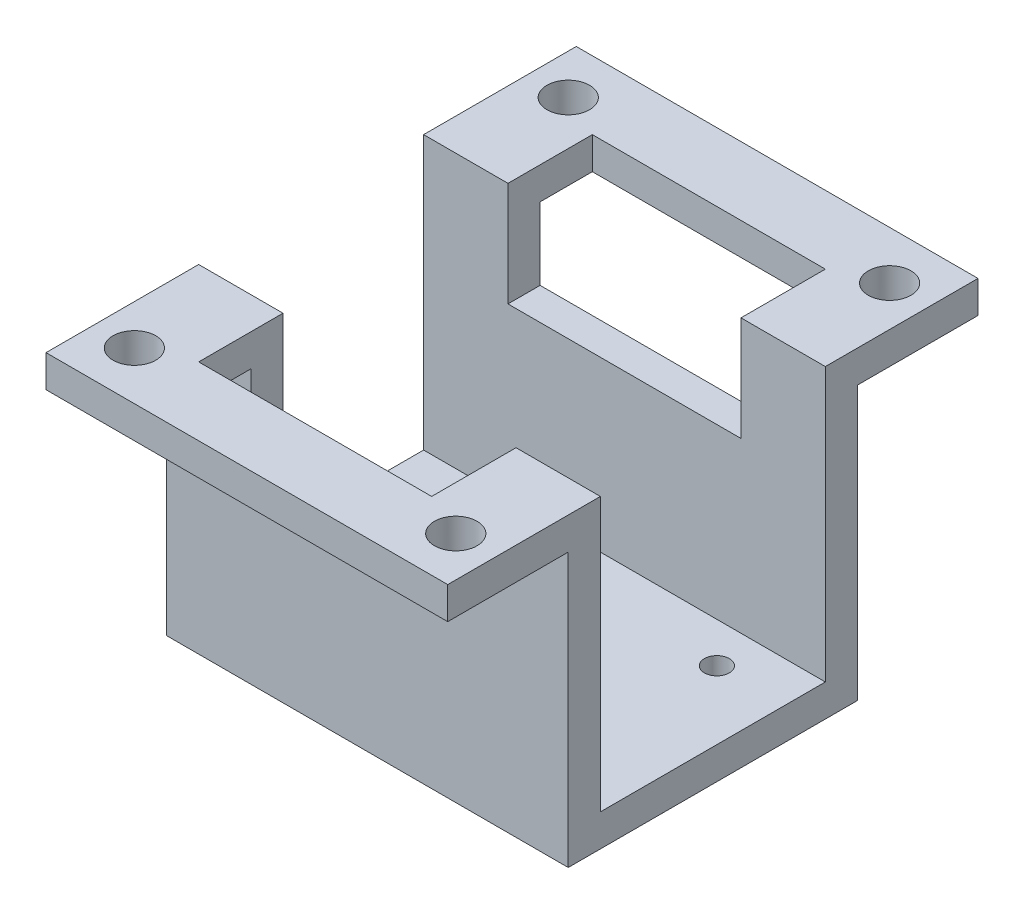
ISO-10303-21;
HEADER;
FILE_DESCRIPTION(('STEP AP214'),'2;1');
FILE_NAME('part.step','',(''),(''),'','','');
FILE_SCHEMA(('AUTOMOTIVE_DESIGN { 1 0 10303 214 1 1 1 1 }'));
ENDSEC;
DATA;
#1=APPLICATION_CONTEXT('core data for automotive mechanical design processes');
#2=APPLICATION_PROTOCOL_DEFINITION('international standard','automotive_design',2000,#1);
#3=PRODUCT_CONTEXT('',#1,'mechanical');
#4=PRODUCT('Part','Part','',(#3));
#5=PRODUCT_RELATED_PRODUCT_CATEGORY('part','',(#4));
#6=PRODUCT_DEFINITION_FORMATION('','',#4);
#7=PRODUCT_DEFINITION_CONTEXT('part definition',#1,'design');
#8=PRODUCT_DEFINITION('design','',#6,#7);
#9=PRODUCT_DEFINITION_SHAPE('','',#8);
#10=(LENGTH_UNIT() NAMED_UNIT(*) SI_UNIT(.MILLI.,.METRE.));
#11=(NAMED_UNIT(*) PLANE_ANGLE_UNIT() SI_UNIT($,.RADIAN.));
#12=(NAMED_UNIT(*) SI_UNIT($,.STERADIAN.) SOLID_ANGLE_UNIT());
#13=UNCERTAINTY_MEASURE_WITH_UNIT(LENGTH_MEASURE(1.E-05),#10,'distance_accuracy_value','');
#14=(GEOMETRIC_REPRESENTATION_CONTEXT(3) GLOBAL_UNCERTAINTY_ASSIGNED_CONTEXT((#13)) GLOBAL_UNIT_ASSIGNED_CONTEXT((#10,
#11,#12)) REPRESENTATION_CONTEXT('',''));
#15=CARTESIAN_POINT('',(0.,0.,0.));
#16=DIRECTION('',(0.,0.,1.));
#17=DIRECTION('',(1.,0.,0.));
#18=AXIS2_PLACEMENT_3D('',#15,#16,#17);
#19=CARTESIAN_POINT('',(0.,38.,0.));
#20=DIRECTION('',(0.,1.,0.));
#21=DIRECTION('',(0.,0.,1.));
#22=AXIS2_PLACEMENT_3D('',#19,#20,#21);
#23=PLANE('',#22);
#24=CARTESIAN_POINT('',(36.5,38.,-36.));
#25=DIRECTION('',(0.,1.,0.));
#26=DIRECTION('',(0.,0.,1.));
#27=AXIS2_PLACEMENT_3D('',#24,#25,#26);
#28=CIRCLE('',#27,2.65);
#29=CARTESIAN_POINT('',(36.5,38.,-33.35));
#30=VERTEX_POINT('',#29);
#31=EDGE_CURVE('E601',#30,#30,#28,.T.);
#32=ORIENTED_EDGE('',*,*,#31,.F.);
#33=EDGE_LOOP('',(#32));
#34=FACE_BOUND('',#33,.T.);
#35=DIRECTION('',(0.,0.,1.));
#36=VECTOR('',#35,1.);
#37=CARTESIAN_POINT('',(2.00000000000001,38.,-27.));
#38=LINE('',#37,#36);
#39=CARTESIAN_POINT('',(2.00000000000001,38.,-33.5));
#40=VERTEX_POINT('',#39);
#41=CARTESIAN_POINT('',(2.00000000000001,38.,-23.));
#42=VERTEX_POINT('',#41);
#43=EDGE_CURVE('E206',#40,#42,#38,.T.);
#44=ORIENTED_EDGE('',*,*,#43,.F.);
#45=DIRECTION('',(-1.,0.,0.));
#46=VECTOR('',#45,1.);
#47=CARTESIAN_POINT('',(2.00000000000001,38.,-33.5));
#48=LINE('',#47,#46);
#49=CARTESIAN_POINT('',(31.,38.,-33.5));
#50=VERTEX_POINT('',#49);
#51=EDGE_CURVE('E225',#50,#40,#48,.T.);
#52=ORIENTED_EDGE('',*,*,#51,.F.);
#53=DIRECTION('',(0.,0.,1.));
#54=VECTOR('',#53,1.);
#55=CARTESIAN_POINT('',(31.,38.,-27.));
#56=LINE('',#55,#54);
#57=CARTESIAN_POINT('',(31.,38.,-23.));
#58=VERTEX_POINT('',#57);
#59=EDGE_CURVE('E207',#50,#58,#56,.T.);
#60=ORIENTED_EDGE('',*,*,#59,.T.);
#61=DIRECTION('',(1.,0.,0.));
#62=VECTOR('',#61,1.);
#63=CARTESIAN_POINT('',(0.,38.,-23.));
#64=LINE('',#63,#62);
#65=CARTESIAN_POINT('',(41.5,38.,-23.));
#66=VERTEX_POINT('',#65);
#67=EDGE_CURVE('E461',#58,#66,#64,.T.);
#68=ORIENTED_EDGE('',*,*,#67,.T.);
#69=DIRECTION('',(0.,0.,-1.));
#70=VECTOR('',#69,1.);
#71=CARTESIAN_POINT('',(41.5,38.,0.));
#72=LINE('',#71,#70);
#73=CARTESIAN_POINT('',(41.5,38.,-42.));
#74=VERTEX_POINT('',#73);
#75=EDGE_CURVE('E476',#66,#74,#72,.T.);
#76=ORIENTED_EDGE('',*,*,#75,.T.);
#77=DIRECTION('',(1.,0.,0.));
#78=VECTOR('',#77,1.);
#79=CARTESIAN_POINT('',(-8.5,38.,-42.));
#80=LINE('',#79,#78);
#81=CARTESIAN_POINT('',(-8.5,38.,-42.));
#82=VERTEX_POINT('',#81);
#83=EDGE_CURVE('E243',#82,#74,#80,.T.);
#84=ORIENTED_EDGE('',*,*,#83,.F.);
#85=DIRECTION('',(0.,0.,1.));
#86=VECTOR('',#85,1.);
#87=CARTESIAN_POINT('',(-8.49999999999999,38.,0.));
#88=LINE('',#87,#86);
#89=CARTESIAN_POINT('',(-8.5,38.,-23.));
#90=VERTEX_POINT('',#89);
#91=EDGE_CURVE('E471',#82,#90,#88,.T.);
#92=ORIENTED_EDGE('',*,*,#91,.T.);
#93=EDGE_CURVE('E474',#90,#42,#64,.T.);
#94=ORIENTED_EDGE('',*,*,#93,.T.);
#95=EDGE_LOOP('',(#44,#52,#60,#68,#76,#84,#92,#94));
#96=FACE_BOUND('',#95,.T.);
#97=CARTESIAN_POINT('',(-3.5,38.,-36.));
#98=DIRECTION('',(0.,1.,0.));
#99=DIRECTION('',(0.,0.,1.));
#100=AXIS2_PLACEMENT_3D('',#97,#98,#99);
#101=CIRCLE('',#100,2.65);
#102=CARTESIAN_POINT('',(-3.5,38.,-33.35));
#103=VERTEX_POINT('',#102);
#104=EDGE_CURVE('E607',#103,#103,#101,.F.);
#105=ORIENTED_EDGE('',*,*,#104,.T.);
#106=EDGE_LOOP('',(#105));
#107=FACE_BOUND('',#106,.T.);
#108=ADVANCED_FACE('F32',(#34,#96,#107),#23,.T.);
#109=CARTESIAN_POINT('',(-8.5,34.,-42.));
#110=DIRECTION('',(0.,1.,0.));
#111=DIRECTION('',(0.,0.,1.));
#112=AXIS2_PLACEMENT_3D('',#109,#110,#111);
#113=PLANE('',#112);
#114=CARTESIAN_POINT('',(36.5,34.,-36.));
#115=DIRECTION('',(0.,-1.,0.));
#116=DIRECTION('',(0.,0.,-1.));
#117=AXIS2_PLACEMENT_3D('',#114,#115,#116);
#118=CIRCLE('',#117,2.65);
#119=CARTESIAN_POINT('',(36.5,34.,-38.65));
#120=VERTEX_POINT('',#119);
#121=EDGE_CURVE('E596',#120,#120,#118,.T.);
#122=ORIENTED_EDGE('',*,*,#121,.F.);
#123=EDGE_LOOP('',(#122));
#124=FACE_BOUND('',#123,.T.);
#125=DIRECTION('',(-1.,0.,0.));
#126=VECTOR('',#125,1.);
#127=CARTESIAN_POINT('',(-8.5,34.,-33.5));
#128=LINE('',#127,#126);
#129=CARTESIAN_POINT('',(31.,34.,-33.5));
#130=VERTEX_POINT('',#129);
#131=CARTESIAN_POINT('',(2.00000000000001,34.,-33.5));
#132=VERTEX_POINT('',#131);
#133=EDGE_CURVE('E274',#130,#132,#128,.T.);
#134=ORIENTED_EDGE('',*,*,#133,.T.);
#135=DIRECTION('',(0.,0.,1.));
#136=VECTOR('',#135,1.);
#137=CARTESIAN_POINT('',(2.00000000000001,34.,-42.));
#138=LINE('',#137,#136);
#139=CARTESIAN_POINT('',(2.00000000000001,34.,-27.));
#140=VERTEX_POINT('',#139);
#141=EDGE_CURVE('E238',#132,#140,#138,.T.);
#142=ORIENTED_EDGE('',*,*,#141,.T.);
#143=DIRECTION('',(-1.,0.,0.));
#144=VECTOR('',#143,1.);
#145=CARTESIAN_POINT('',(-8.5,34.,-27.));
#146=LINE('',#145,#144);
#147=CARTESIAN_POINT('',(-8.5,34.,-27.));
#148=VERTEX_POINT('',#147);
#149=EDGE_CURVE('E257',#140,#148,#146,.T.);
#150=ORIENTED_EDGE('',*,*,#149,.T.);
#151=DIRECTION('',(0.,0.,1.));
#152=VECTOR('',#151,1.);
#153=CARTESIAN_POINT('',(-8.5,34.,-42.));
#154=LINE('',#153,#152);
#155=CARTESIAN_POINT('',(-8.5,34.,-42.));
#156=VERTEX_POINT('',#155);
#157=EDGE_CURVE('E250',#156,#148,#154,.T.);
#158=ORIENTED_EDGE('',*,*,#157,.F.);
#159=DIRECTION('',(-1.,0.,0.));
#160=VECTOR('',#159,1.);
#161=CARTESIAN_POINT('',(-8.5,34.,-42.));
#162=LINE('',#161,#160);
#163=CARTESIAN_POINT('',(41.5,34.,-42.));
#164=VERTEX_POINT('',#163);
#165=EDGE_CURVE('E248',#164,#156,#162,.T.);
#166=ORIENTED_EDGE('',*,*,#165,.F.);
#167=DIRECTION('',(0.,0.,1.));
#168=VECTOR('',#167,1.);
#169=CARTESIAN_POINT('',(41.5,34.,-42.));
#170=LINE('',#169,#168);
#171=CARTESIAN_POINT('',(41.5,34.,-27.));
#172=VERTEX_POINT('',#171);
#173=EDGE_CURVE('E265',#164,#172,#170,.T.);
#174=ORIENTED_EDGE('',*,*,#173,.T.);
#175=CARTESIAN_POINT('',(31.,34.,-27.));
#176=VERTEX_POINT('',#175);
#177=EDGE_CURVE('E55',#172,#176,#146,.T.);
#178=ORIENTED_EDGE('',*,*,#177,.T.);
#179=DIRECTION('',(0.,0.,-1.));
#180=VECTOR('',#179,1.);
#181=CARTESIAN_POINT('',(31.,34.,-42.));
#182=LINE('',#181,#180);
#183=EDGE_CURVE('E233',#176,#130,#182,.T.);
#184=ORIENTED_EDGE('',*,*,#183,.T.);
#185=EDGE_LOOP('',(#134,#142,#150,#158,#166,#174,#178,#184));
#186=FACE_BOUND('',#185,.T.);
#187=CARTESIAN_POINT('',(-3.5,34.,-36.));
#188=DIRECTION('',(0.,-1.,0.));
#189=DIRECTION('',(0.,0.,-1.));
#190=AXIS2_PLACEMENT_3D('',#187,#188,#189);
#191=CIRCLE('',#190,2.65);
#192=CARTESIAN_POINT('',(-3.5,34.,-38.65));
#193=VERTEX_POINT('',#192);
#194=EDGE_CURVE('E604',#193,#193,#191,.F.);
#195=ORIENTED_EDGE('',*,*,#194,.T.);
#196=EDGE_LOOP('',(#195));
#197=FACE_BOUND('',#196,.T.);
#198=ADVANCED_FACE('F413',(#124,#186,#197),#113,.F.);
#199=CARTESIAN_POINT('',(0.,38.,0.));
#200=DIRECTION('',(0.,1.,0.));
#201=DIRECTION('',(0.,0.,1.));
#202=AXIS2_PLACEMENT_3D('',#199,#200,#201);
#203=PLANE('',#202);
#204=CARTESIAN_POINT('',(-3.5,38.,18.));
#205=DIRECTION('',(0.,1.,0.));
#206=DIRECTION('',(0.,0.,1.));
#207=AXIS2_PLACEMENT_3D('',#204,#205,#206);
#208=CIRCLE('',#207,2.65);
#209=CARTESIAN_POINT('',(-3.5,38.,20.65));
#210=VERTEX_POINT('',#209);
#211=EDGE_CURVE('E592',#210,#210,#208,.T.);
#212=ORIENTED_EDGE('',*,*,#211,.F.);
#213=EDGE_LOOP('',(#212));
#214=FACE_BOUND('',#213,.T.);
#215=DIRECTION('',(1.,0.,0.));
#216=VECTOR('',#215,1.);
#217=CARTESIAN_POINT('',(2.00000000000001,38.,15.5));
#218=LINE('',#217,#216);
#219=CARTESIAN_POINT('',(2.00000000000001,38.,15.5));
#220=VERTEX_POINT('',#219);
#221=CARTESIAN_POINT('',(31.,38.,15.5));
#222=VERTEX_POINT('',#221);
#223=EDGE_CURVE('E210',#220,#222,#218,.T.);
#224=ORIENTED_EDGE('',*,*,#223,.F.);
#225=CARTESIAN_POINT('',(2.00000000000001,38.,5.));
#226=VERTEX_POINT('',#225);
#227=EDGE_CURVE('E195',#226,#220,#38,.T.);
#228=ORIENTED_EDGE('',*,*,#227,.F.);
#229=DIRECTION('',(1.,0.,0.));
#230=VECTOR('',#229,1.);
#231=CARTESIAN_POINT('',(0.,38.,5.));
#232=LINE('',#231,#230);
#233=CARTESIAN_POINT('',(-8.49999999999999,38.,5.));
#234=VERTEX_POINT('',#233);
#235=EDGE_CURVE('E332',#234,#226,#232,.T.);
#236=ORIENTED_EDGE('',*,*,#235,.F.);
#237=DIRECTION('',(0.,0.,1.));
#238=VECTOR('',#237,1.);
#239=CARTESIAN_POINT('',(-8.49999999999999,38.,0.));
#240=LINE('',#239,#238);
#241=CARTESIAN_POINT('',(-8.49999999999999,38.,24.));
#242=VERTEX_POINT('',#241);
#243=EDGE_CURVE('E331',#234,#242,#240,.T.);
#244=ORIENTED_EDGE('',*,*,#243,.T.);
#245=DIRECTION('',(-1.,0.,0.));
#246=VECTOR('',#245,1.);
#247=CARTESIAN_POINT('',(-8.49999999999999,38.,24.));
#248=LINE('',#247,#246);
#249=CARTESIAN_POINT('',(41.5,38.,24.));
#250=VERTEX_POINT('',#249);
#251=EDGE_CURVE('E253',#250,#242,#248,.T.);
#252=ORIENTED_EDGE('',*,*,#251,.F.);
#253=DIRECTION('',(0.,0.,-1.));
#254=VECTOR('',#253,1.);
#255=CARTESIAN_POINT('',(41.5,38.,0.));
#256=LINE('',#255,#254);
#257=CARTESIAN_POINT('',(41.5,38.,5.));
#258=VERTEX_POINT('',#257);
#259=EDGE_CURVE('E328',#250,#258,#256,.T.);
#260=ORIENTED_EDGE('',*,*,#259,.T.);
#261=CARTESIAN_POINT('',(31.,38.,5.));
#262=VERTEX_POINT('',#261);
#263=EDGE_CURVE('E360',#262,#258,#232,.T.);
#264=ORIENTED_EDGE('',*,*,#263,.F.);
#265=EDGE_CURVE('E217',#262,#222,#56,.T.);
#266=ORIENTED_EDGE('',*,*,#265,.T.);
#267=EDGE_LOOP('',(#224,#228,#236,#244,#252,#260,#264,#266));
#268=FACE_BOUND('',#267,.T.);
#269=CARTESIAN_POINT('',(36.5,38.,18.));
#270=DIRECTION('',(0.,1.,0.));
#271=DIRECTION('',(0.,0.,1.));
#272=AXIS2_PLACEMENT_3D('',#269,#270,#271);
#273=CIRCLE('',#272,2.65);
#274=CARTESIAN_POINT('',(36.5,38.,20.65));
#275=VERTEX_POINT('',#274);
#276=EDGE_CURVE('E218',#275,#275,#273,.F.);
#277=ORIENTED_EDGE('',*,*,#276,.T.);
#278=EDGE_LOOP('',(#277));
#279=FACE_BOUND('',#278,.T.);
#280=ADVANCED_FACE('F214',(#214,#268,#279),#203,.T.);
#281=CARTESIAN_POINT('',(2.00000000000001,34.,24.));
#282=DIRECTION('',(0.,1.,0.));
#283=DIRECTION('',(0.,0.,1.));
#284=AXIS2_PLACEMENT_3D('',#281,#282,#283);
#285=PLANE('',#284);
#286=CARTESIAN_POINT('',(-3.5,34.,18.));
#287=DIRECTION('',(0.,-1.,0.));
#288=DIRECTION('',(0.,0.,-1.));
#289=AXIS2_PLACEMENT_3D('',#286,#287,#288);
#290=CIRCLE('',#289,2.65);
#291=CARTESIAN_POINT('',(-3.5,34.,15.35));
#292=VERTEX_POINT('',#291);
#293=EDGE_CURVE('E594',#292,#292,#290,.T.);
#294=ORIENTED_EDGE('',*,*,#293,.F.);
#295=EDGE_LOOP('',(#294));
#296=FACE_BOUND('',#295,.T.);
#297=DIRECTION('',(1.,0.,0.));
#298=VECTOR('',#297,1.);
#299=CARTESIAN_POINT('',(2.00000000000001,34.,9.));
#300=LINE('',#299,#298);
#301=CARTESIAN_POINT('',(-8.49999999999999,34.,9.));
#302=VERTEX_POINT('',#301);
#303=CARTESIAN_POINT('',(2.00000000000001,34.,9.));
#304=VERTEX_POINT('',#303);
#305=EDGE_CURVE('E268',#302,#304,#300,.T.);
#306=ORIENTED_EDGE('',*,*,#305,.T.);
#307=DIRECTION('',(0.,0.,1.));
#308=VECTOR('',#307,1.);
#309=CARTESIAN_POINT('',(2.00000000000001,34.,24.));
#310=LINE('',#309,#308);
#311=CARTESIAN_POINT('',(2.00000000000001,34.,15.5));
#312=VERTEX_POINT('',#311);
#313=EDGE_CURVE('E11',#304,#312,#310,.T.);
#314=ORIENTED_EDGE('',*,*,#313,.T.);
#315=DIRECTION('',(1.,0.,0.));
#316=VECTOR('',#315,1.);
#317=CARTESIAN_POINT('',(2.00000000000001,34.,15.5));
#318=LINE('',#317,#316);
#319=CARTESIAN_POINT('',(31.,34.,15.5));
#320=VERTEX_POINT('',#319);
#321=EDGE_CURVE('E212',#312,#320,#318,.T.);
#322=ORIENTED_EDGE('',*,*,#321,.T.);
#323=DIRECTION('',(0.,0.,-1.));
#324=VECTOR('',#323,1.);
#325=CARTESIAN_POINT('',(31.,34.,24.));
#326=LINE('',#325,#324);
#327=CARTESIAN_POINT('',(31.,34.,9.));
#328=VERTEX_POINT('',#327);
#329=EDGE_CURVE('E40',#320,#328,#326,.T.);
#330=ORIENTED_EDGE('',*,*,#329,.T.);
#331=CARTESIAN_POINT('',(41.5,34.,9.));
#332=VERTEX_POINT('',#331);
#333=EDGE_CURVE('E302',#328,#332,#300,.T.);
#334=ORIENTED_EDGE('',*,*,#333,.T.);
#335=DIRECTION('',(0.,0.,-1.));
#336=VECTOR('',#335,1.);
#337=CARTESIAN_POINT('',(41.5,34.,24.));
#338=LINE('',#337,#336);
#339=CARTESIAN_POINT('',(41.5,34.,24.));
#340=VERTEX_POINT('',#339);
#341=EDGE_CURVE('E309',#340,#332,#338,.T.);
#342=ORIENTED_EDGE('',*,*,#341,.F.);
#343=DIRECTION('',(1.,0.,0.));
#344=VECTOR('',#343,1.);
#345=CARTESIAN_POINT('',(-8.49999999999999,34.,24.));
#346=LINE('',#345,#344);
#347=CARTESIAN_POINT('',(-8.49999999999999,34.,24.));
#348=VERTEX_POINT('',#347);
#349=EDGE_CURVE('E318',#348,#340,#346,.T.);
#350=ORIENTED_EDGE('',*,*,#349,.F.);
#351=DIRECTION('',(0.,0.,-1.));
#352=VECTOR('',#351,1.);
#353=CARTESIAN_POINT('',(-8.49999999999999,34.,24.));
#354=LINE('',#353,#352);
#355=EDGE_CURVE('E291',#348,#302,#354,.T.);
#356=ORIENTED_EDGE('',*,*,#355,.T.);
#357=EDGE_LOOP('',(#306,#314,#322,#330,#334,#342,#350,#356));
#358=FACE_BOUND('',#357,.T.);
#359=CARTESIAN_POINT('',(36.5,34.,18.));
#360=DIRECTION('',(0.,-1.,0.));
#361=DIRECTION('',(0.,0.,-1.));
#362=AXIS2_PLACEMENT_3D('',#359,#360,#361);
#363=CIRCLE('',#362,2.65);
#364=CARTESIAN_POINT('',(36.5,34.,15.35));
#365=VERTEX_POINT('',#364);
#366=EDGE_CURVE('E221',#365,#365,#363,.F.);
#367=ORIENTED_EDGE('',*,*,#366,.T.);
#368=EDGE_LOOP('',(#367));
#369=FACE_BOUND('',#368,.T.);
#370=ADVANCED_FACE('F341',(#296,#358,#369),#285,.F.);
#371=CARTESIAN_POINT('',(-8.5,4.,-27.));
#372=DIRECTION('',(0.,0.,1.));
#373=DIRECTION('',(1.,0.,0.));
#374=AXIS2_PLACEMENT_3D('',#371,#372,#373);
#375=PLANE('',#374);
#376=DIRECTION('',(-1.,0.,0.));
#377=VECTOR('',#376,1.);
#378=CARTESIAN_POINT('',(-8.5,0.,-27.));
#379=LINE('',#378,#377);
#380=CARTESIAN_POINT('',(41.5,0.,-27.));
#381=VERTEX_POINT('',#380);
#382=CARTESIAN_POINT('',(-8.5,0.,-27.));
#383=VERTEX_POINT('',#382);
#384=EDGE_CURVE('E381',#381,#383,#379,.T.);
#385=ORIENTED_EDGE('',*,*,#384,.T.);
#386=DIRECTION('',(0.,-1.,0.));
#387=VECTOR('',#386,1.);
#388=CARTESIAN_POINT('',(-8.5,4.,-27.));
#389=LINE('',#388,#387);
#390=EDGE_CURVE('E392',#148,#383,#389,.T.);
#391=ORIENTED_EDGE('',*,*,#390,.F.);
#392=ORIENTED_EDGE('',*,*,#149,.F.);
#393=DIRECTION('',(0.,-1.,0.));
#394=VECTOR('',#393,1.);
#395=CARTESIAN_POINT('',(2.00000000000001,38.,-27.));
#396=LINE('',#395,#394);
#397=CARTESIAN_POINT('',(2.00000000000001,25.,-27.));
#398=VERTEX_POINT('',#397);
#399=EDGE_CURVE('E298',#140,#398,#396,.T.);
#400=ORIENTED_EDGE('',*,*,#399,.T.);
#401=DIRECTION('',(1.,0.,0.));
#402=VECTOR('',#401,1.);
#403=CARTESIAN_POINT('',(2.00000000000001,25.,-27.));
#404=LINE('',#403,#402);
#405=CARTESIAN_POINT('',(31.,25.,-27.));
#406=VERTEX_POINT('',#405);
#407=EDGE_CURVE('E427',#398,#406,#404,.T.);
#408=ORIENTED_EDGE('',*,*,#407,.T.);
#409=DIRECTION('',(0.,1.,0.));
#410=VECTOR('',#409,1.);
#411=CARTESIAN_POINT('',(31.,38.,-27.));
#412=LINE('',#411,#410);
#413=EDGE_CURVE('E431',#406,#176,#412,.T.);
#414=ORIENTED_EDGE('',*,*,#413,.T.);
#415=ORIENTED_EDGE('',*,*,#177,.F.);
#416=DIRECTION('',(0.,-1.,0.));
#417=VECTOR('',#416,1.);
#418=CARTESIAN_POINT('',(41.5,4.,-27.));
#419=LINE('',#418,#417);
#420=EDGE_CURVE('E395',#172,#381,#419,.T.);
#421=ORIENTED_EDGE('',*,*,#420,.T.);
#422=EDGE_LOOP('',(#385,#391,#392,#400,#408,#414,#415,#421));
#423=FACE_BOUND('',#422,.T.);
#424=ADVANCED_FACE('F403',(#423),#375,.F.);
#425=CARTESIAN_POINT('',(-8.49999999999999,4.,9.));
#426=DIRECTION('',(0.,0.,-1.));
#427=DIRECTION('',(-1.,0.,0.));
#428=AXIS2_PLACEMENT_3D('',#425,#426,#427);
#429=PLANE('',#428);
#430=DIRECTION('',(0.,1.,0.));
#431=VECTOR('',#430,1.);
#432=CARTESIAN_POINT('',(31.,38.,9.));
#433=LINE('',#432,#431);
#434=CARTESIAN_POINT('',(31.,25.,9.));
#435=VERTEX_POINT('',#434);
#436=EDGE_CURVE('E421',#435,#328,#433,.T.);
#437=ORIENTED_EDGE('',*,*,#436,.F.);
#438=DIRECTION('',(1.,0.,0.));
#439=VECTOR('',#438,1.);
#440=CARTESIAN_POINT('',(2.00000000000001,25.,9.));
#441=LINE('',#440,#439);
#442=CARTESIAN_POINT('',(2.00000000000001,25.,9.));
#443=VERTEX_POINT('',#442);
#444=EDGE_CURVE('E426',#443,#435,#441,.T.);
#445=ORIENTED_EDGE('',*,*,#444,.F.);
#446=DIRECTION('',(0.,-1.,0.));
#447=VECTOR('',#446,1.);
#448=CARTESIAN_POINT('',(2.00000000000001,38.,9.));
#449=LINE('',#448,#447);
#450=EDGE_CURVE('E316',#304,#443,#449,.T.);
#451=ORIENTED_EDGE('',*,*,#450,.F.);
#452=ORIENTED_EDGE('',*,*,#305,.F.);
#453=DIRECTION('',(0.,-1.,0.));
#454=VECTOR('',#453,1.);
#455=CARTESIAN_POINT('',(-8.49999999999999,4.,9.));
#456=LINE('',#455,#454);
#457=CARTESIAN_POINT('',(-8.49999999999999,0.,9.));
#458=VERTEX_POINT('',#457);
#459=EDGE_CURVE('E339',#302,#458,#456,.T.);
#460=ORIENTED_EDGE('',*,*,#459,.T.);
#461=DIRECTION('',(1.,0.,0.));
#462=VECTOR('',#461,1.);
#463=CARTESIAN_POINT('',(-8.49999999999999,0.,9.));
#464=LINE('',#463,#462);
#465=CARTESIAN_POINT('',(41.5,0.,9.));
#466=VERTEX_POINT('',#465);
#467=EDGE_CURVE('E386',#458,#466,#464,.T.);
#468=ORIENTED_EDGE('',*,*,#467,.T.);
#469=DIRECTION('',(0.,-1.,0.));
#470=VECTOR('',#469,1.);
#471=CARTESIAN_POINT('',(41.5,4.,9.));
#472=LINE('',#471,#470);
#473=EDGE_CURVE('E306',#332,#466,#472,.T.);
#474=ORIENTED_EDGE('',*,*,#473,.F.);
#475=ORIENTED_EDGE('',*,*,#333,.F.);
#476=EDGE_LOOP('',(#437,#445,#451,#452,#460,#468,#474,#475));
#477=FACE_BOUND('',#476,.T.);
#478=ADVANCED_FACE('F419',(#477),#429,.F.);
#479=CARTESIAN_POINT('',(0.,4.,0.));
#480=DIRECTION('',(0.,1.,0.));
#481=DIRECTION('',(0.,0.,1.));
#482=AXIS2_PLACEMENT_3D('',#479,#480,#481);
#483=PLANE('',#482);
#484=CARTESIAN_POINT('',(33.,4.,-18.));
#485=DIRECTION('',(0.,1.,0.));
#486=DIRECTION('',(0.,0.,1.));
#487=AXIS2_PLACEMENT_3D('',#484,#485,#486);
#488=CIRCLE('',#487,1.55);
#489=CARTESIAN_POINT('',(33.,4.,-16.45));
#490=VERTEX_POINT('',#489);
#491=EDGE_CURVE('E913',#490,#490,#488,.T.);
#492=ORIENTED_EDGE('',*,*,#491,.F.);
#493=EDGE_LOOP('',(#492));
#494=FACE_BOUND('',#493,.T.);
#495=CARTESIAN_POINT('',(0.,4.,0.));
#496=DIRECTION('',(0.,1.,0.));
#497=DIRECTION('',(0.,0.,1.));
#498=AXIS2_PLACEMENT_3D('',#495,#496,#497);
#499=CIRCLE('',#498,1.55);
#500=CARTESIAN_POINT('',(0.,4.,1.55));
#501=VERTEX_POINT('',#500);
#502=EDGE_CURVE('E889',#501,#501,#499,.T.);
#503=ORIENTED_EDGE('',*,*,#502,.F.);
#504=EDGE_LOOP('',(#503));
#505=FACE_BOUND('',#504,.T.);
#506=CARTESIAN_POINT('',(0.,4.,-18.));
#507=DIRECTION('',(0.,1.,0.));
#508=DIRECTION('',(0.,0.,1.));
#509=AXIS2_PLACEMENT_3D('',#506,#507,#508);
#510=CIRCLE('',#509,1.55);
#511=CARTESIAN_POINT('',(0.,4.,-16.45));
#512=VERTEX_POINT('',#511);
#513=EDGE_CURVE('E382',#512,#512,#510,.T.);
#514=ORIENTED_EDGE('',*,*,#513,.F.);
#515=EDGE_LOOP('',(#514));
#516=FACE_BOUND('',#515,.T.);
#517=CARTESIAN_POINT('',(33.,4.,0.));
#518=DIRECTION('',(0.,1.,0.));
#519=DIRECTION('',(0.,0.,1.));
#520=AXIS2_PLACEMENT_3D('',#517,#518,#519);
#521=CIRCLE('',#520,1.55);
#522=CARTESIAN_POINT('',(33.,4.,1.55));
#523=VERTEX_POINT('',#522);
#524=EDGE_CURVE('E890',#523,#523,#521,.T.);
#525=ORIENTED_EDGE('',*,*,#524,.F.);
#526=EDGE_LOOP('',(#525));
#527=FACE_BOUND('',#526,.T.);
#528=CARTESIAN_POINT('',(9.,4.,-9.));
#529=DIRECTION('',(0.,1.,0.));
#530=DIRECTION('',(0.,0.,1.));
#531=AXIS2_PLACEMENT_3D('',#528,#529,#530);
#532=CIRCLE('',#531,8.);
#533=CARTESIAN_POINT('',(9.,4.,-0.999999999999999));
#534=VERTEX_POINT('',#533);
#535=EDGE_CURVE('E354',#534,#534,#532,.T.);
#536=ORIENTED_EDGE('',*,*,#535,.F.);
#537=EDGE_LOOP('',(#536));
#538=FACE_BOUND('',#537,.T.);
#539=DIRECTION('',(0.,0.,-1.));
#540=VECTOR('',#539,1.);
#541=CARTESIAN_POINT('',(41.5,4.,-27.));
#542=LINE('',#541,#540);
#543=CARTESIAN_POINT('',(41.5,4.,4.99999999999999));
#544=VERTEX_POINT('',#543);
#545=CARTESIAN_POINT('',(41.5,4.,-23.));
#546=VERTEX_POINT('',#545);
#547=EDGE_CURVE('E362',#544,#546,#542,.T.);
#548=ORIENTED_EDGE('',*,*,#547,.T.);
#549=DIRECTION('',(1.,0.,0.));
#550=VECTOR('',#549,1.);
#551=CARTESIAN_POINT('',(0.,4.,-23.));
#552=LINE('',#551,#550);
#553=CARTESIAN_POINT('',(-8.5,4.,-23.));
#554=VERTEX_POINT('',#553);
#555=EDGE_CURVE('E470',#554,#546,#552,.T.);
#556=ORIENTED_EDGE('',*,*,#555,.F.);
#557=DIRECTION('',(0.,0.,1.));
#558=VECTOR('',#557,1.);
#559=CARTESIAN_POINT('',(-8.5,4.,-27.));
#560=LINE('',#559,#558);
#561=CARTESIAN_POINT('',(-8.49999999999999,4.,5.));
#562=VERTEX_POINT('',#561);
#563=EDGE_CURVE('E372',#554,#562,#560,.T.);
#564=ORIENTED_EDGE('',*,*,#563,.T.);
#565=DIRECTION('',(1.,0.,0.));
#566=VECTOR('',#565,1.);
#567=CARTESIAN_POINT('',(0.,4.,5.));
#568=LINE('',#567,#566);
#569=EDGE_CURVE('E357',#562,#544,#568,.T.);
#570=ORIENTED_EDGE('',*,*,#569,.T.);
#571=EDGE_LOOP('',(#548,#556,#564,#570));
#572=FACE_BOUND('',#571,.T.);
#573=ADVANCED_FACE('F543',(#494,#505,#516,#527,#538,#572),#483,.T.);
#574=CARTESIAN_POINT('',(0.,0.,0.));
#575=DIRECTION('',(0.,1.,0.));
#576=DIRECTION('',(0.,0.,1.));
#577=AXIS2_PLACEMENT_3D('',#574,#575,#576);
#578=PLANE('',#577);
#579=CARTESIAN_POINT('',(33.,0.,-18.));
#580=DIRECTION('',(0.,1.,0.));
#581=DIRECTION('',(0.,0.,1.));
#582=AXIS2_PLACEMENT_3D('',#579,#580,#581);
#583=CIRCLE('',#582,1.55);
#584=CARTESIAN_POINT('',(33.,0.,-16.45));
#585=VERTEX_POINT('',#584);
#586=EDGE_CURVE('E884',#585,#585,#583,.T.);
#587=ORIENTED_EDGE('',*,*,#586,.T.);
#588=EDGE_LOOP('',(#587));
#589=FACE_BOUND('',#588,.T.);
#590=CARTESIAN_POINT('',(0.,0.,0.));
#591=DIRECTION('',(0.,1.,0.));
#592=DIRECTION('',(0.,0.,1.));
#593=AXIS2_PLACEMENT_3D('',#590,#591,#592);
#594=CIRCLE('',#593,1.55);
#595=CARTESIAN_POINT('',(0.,0.,1.55));
#596=VERTEX_POINT('',#595);
#597=EDGE_CURVE('E887',#596,#596,#594,.T.);
#598=ORIENTED_EDGE('',*,*,#597,.T.);
#599=EDGE_LOOP('',(#598));
#600=FACE_BOUND('',#599,.T.);
#601=DIRECTION('',(0.,0.,-1.));
#602=VECTOR('',#601,1.);
#603=CARTESIAN_POINT('',(41.5,0.,-27.));
#604=LINE('',#603,#602);
#605=EDGE_CURVE('E379',#466,#381,#604,.T.);
#606=ORIENTED_EDGE('',*,*,#605,.F.);
#607=ORIENTED_EDGE('',*,*,#467,.F.);
#608=DIRECTION('',(0.,0.,1.));
#609=VECTOR('',#608,1.);
#610=CARTESIAN_POINT('',(-8.5,0.,-27.));
#611=LINE('',#610,#609);
#612=EDGE_CURVE('E384',#383,#458,#611,.T.);
#613=ORIENTED_EDGE('',*,*,#612,.F.);
#614=ORIENTED_EDGE('',*,*,#384,.F.);
#615=EDGE_LOOP('',(#606,#607,#613,#614));
#616=FACE_BOUND('',#615,.T.);
#617=CARTESIAN_POINT('',(0.,0.,-18.));
#618=DIRECTION('',(0.,1.,0.));
#619=DIRECTION('',(0.,0.,1.));
#620=AXIS2_PLACEMENT_3D('',#617,#618,#619);
#621=CIRCLE('',#620,1.55);
#622=CARTESIAN_POINT('',(0.,0.,-16.45));
#623=VERTEX_POINT('',#622);
#624=EDGE_CURVE('E893',#623,#623,#621,.T.);
#625=ORIENTED_EDGE('',*,*,#624,.T.);
#626=EDGE_LOOP('',(#625));
#627=FACE_BOUND('',#626,.T.);
#628=CARTESIAN_POINT('',(33.,0.,0.));
#629=DIRECTION('',(0.,1.,0.));
#630=DIRECTION('',(0.,0.,1.));
#631=AXIS2_PLACEMENT_3D('',#628,#629,#630);
#632=CIRCLE('',#631,1.55);
#633=CARTESIAN_POINT('',(33.,0.,1.55));
#634=VERTEX_POINT('',#633);
#635=EDGE_CURVE('E896',#634,#634,#632,.T.);
#636=ORIENTED_EDGE('',*,*,#635,.T.);
#637=EDGE_LOOP('',(#636));
#638=FACE_BOUND('',#637,.T.);
#639=CARTESIAN_POINT('',(9.,0.,-9.));
#640=DIRECTION('',(0.,1.,0.));
#641=DIRECTION('',(0.,0.,1.));
#642=AXIS2_PLACEMENT_3D('',#639,#640,#641);
#643=CIRCLE('',#642,8.);
#644=CARTESIAN_POINT('',(9.,0.,-0.999999999999999));
#645=VERTEX_POINT('',#644);
#646=EDGE_CURVE('E369',#645,#645,#643,.T.);
#647=ORIENTED_EDGE('',*,*,#646,.T.);
#648=EDGE_LOOP('',(#647));
#649=FACE_BOUND('',#648,.T.);
#650=ADVANCED_FACE('F400',(#589,#600,#616,#627,#638,#649),#578,.F.);
#651=CARTESIAN_POINT('',(41.5,4.,-27.));
#652=DIRECTION('',(-1.,0.,0.));
#653=DIRECTION('',(0.,0.,1.));
#654=AXIS2_PLACEMENT_3D('',#651,#652,#653);
#655=PLANE('',#654);
#656=ORIENTED_EDGE('',*,*,#605,.T.);
#657=ORIENTED_EDGE('',*,*,#420,.F.);
#658=ORIENTED_EDGE('',*,*,#173,.F.);
#659=DIRECTION('',(0.,-1.,0.));
#660=VECTOR('',#659,1.);
#661=CARTESIAN_POINT('',(41.5,38.,-42.));
#662=LINE('',#661,#660);
#663=EDGE_CURVE('E246',#74,#164,#662,.T.);
#664=ORIENTED_EDGE('',*,*,#663,.F.);
#665=ORIENTED_EDGE('',*,*,#75,.F.);
#666=DIRECTION('',(0.,-1.,0.));
#667=VECTOR('',#666,1.);
#668=CARTESIAN_POINT('',(41.5,38.,-23.));
#669=LINE('',#668,#667);
#670=EDGE_CURVE('E478',#66,#546,#669,.T.);
#671=ORIENTED_EDGE('',*,*,#670,.T.);
#672=ORIENTED_EDGE('',*,*,#547,.F.);
#673=DIRECTION('',(0.,-1.,0.));
#674=VECTOR('',#673,1.);
#675=CARTESIAN_POINT('',(41.5,38.,5.));
#676=LINE('',#675,#674);
#677=EDGE_CURVE('E346',#258,#544,#676,.T.);
#678=ORIENTED_EDGE('',*,*,#677,.F.);
#679=ORIENTED_EDGE('',*,*,#259,.F.);
#680=DIRECTION('',(0.,1.,0.));
#681=VECTOR('',#680,1.);
#682=CARTESIAN_POINT('',(41.5,38.,24.));
#683=LINE('',#682,#681);
#684=EDGE_CURVE('E296',#340,#250,#683,.T.);
#685=ORIENTED_EDGE('',*,*,#684,.F.);
#686=ORIENTED_EDGE('',*,*,#341,.T.);
#687=ORIENTED_EDGE('',*,*,#473,.T.);
#688=EDGE_LOOP('',(#656,#657,#658,#664,#665,#671,#672,#678,#679,#685,#686,#687));
#689=FACE_BOUND('',#688,.T.);
#690=ADVANCED_FACE('F34',(#689),#655,.F.);
#691=CARTESIAN_POINT('',(-8.5,4.,-27.));
#692=DIRECTION('',(1.,0.,0.));
#693=DIRECTION('',(0.,0.,-1.));
#694=AXIS2_PLACEMENT_3D('',#691,#692,#693);
#695=PLANE('',#694);
#696=ORIENTED_EDGE('',*,*,#612,.T.);
#697=ORIENTED_EDGE('',*,*,#459,.F.);
#698=ORIENTED_EDGE('',*,*,#355,.F.);
#699=DIRECTION('',(0.,-1.,0.));
#700=VECTOR('',#699,1.);
#701=CARTESIAN_POINT('',(-8.49999999999999,38.,24.));
#702=LINE('',#701,#700);
#703=EDGE_CURVE('E321',#242,#348,#702,.T.);
#704=ORIENTED_EDGE('',*,*,#703,.F.);
#705=ORIENTED_EDGE('',*,*,#243,.F.);
#706=DIRECTION('',(0.,-1.,0.));
#707=VECTOR('',#706,1.);
#708=CARTESIAN_POINT('',(-8.49999999999999,38.,5.));
#709=LINE('',#708,#707);
#710=EDGE_CURVE('E348',#234,#562,#709,.T.);
#711=ORIENTED_EDGE('',*,*,#710,.T.);
#712=ORIENTED_EDGE('',*,*,#563,.F.);
#713=DIRECTION('',(0.,-1.,0.));
#714=VECTOR('',#713,1.);
#715=CARTESIAN_POINT('',(-8.5,38.,-23.));
#716=LINE('',#715,#714);
#717=EDGE_CURVE('E361',#90,#554,#716,.T.);
#718=ORIENTED_EDGE('',*,*,#717,.F.);
#719=ORIENTED_EDGE('',*,*,#91,.F.);
#720=DIRECTION('',(0.,1.,0.));
#721=VECTOR('',#720,1.);
#722=CARTESIAN_POINT('',(-8.5,38.,-42.));
#723=LINE('',#722,#721);
#724=EDGE_CURVE('E240',#156,#82,#723,.T.);
#725=ORIENTED_EDGE('',*,*,#724,.F.);
#726=ORIENTED_EDGE('',*,*,#157,.T.);
#727=ORIENTED_EDGE('',*,*,#390,.T.);
#728=EDGE_LOOP('',(#696,#697,#698,#704,#705,#711,#712,#718,#719,#725,#726,#727));
#729=FACE_BOUND('',#728,.T.);
#730=ADVANCED_FACE('F337',(#729),#695,.F.);
#731=CARTESIAN_POINT('',(0.,4.,-18.));
#732=DIRECTION('',(0.,-1.,0.));
#733=DIRECTION('',(0.,0.,-1.));
#734=AXIS2_PLACEMENT_3D('',#731,#732,#733);
#735=CYLINDRICAL_SURFACE('',#734,1.55);
#736=ORIENTED_EDGE('',*,*,#513,.T.);
#737=EDGE_LOOP('',(#736));
#738=FACE_BOUND('',#737,.T.);
#739=ORIENTED_EDGE('',*,*,#624,.F.);
#740=EDGE_LOOP('',(#739));
#741=FACE_BOUND('',#740,.T.);
#742=ADVANCED_FACE('F538',(#738,#741),#735,.F.);
#743=CARTESIAN_POINT('',(0.,4.,0.));
#744=DIRECTION('',(0.,-1.,0.));
#745=DIRECTION('',(0.,0.,-1.));
#746=AXIS2_PLACEMENT_3D('',#743,#744,#745);
#747=CYLINDRICAL_SURFACE('',#746,1.55);
#748=ORIENTED_EDGE('',*,*,#502,.T.);
#749=EDGE_LOOP('',(#748));
#750=FACE_BOUND('',#749,.T.);
#751=ORIENTED_EDGE('',*,*,#597,.F.);
#752=EDGE_LOOP('',(#751));
#753=FACE_BOUND('',#752,.T.);
#754=ADVANCED_FACE('F534',(#750,#753),#747,.F.);
#755=CARTESIAN_POINT('',(33.,4.,0.));
#756=DIRECTION('',(0.,-1.,0.));
#757=DIRECTION('',(0.,0.,-1.));
#758=AXIS2_PLACEMENT_3D('',#755,#756,#757);
#759=CYLINDRICAL_SURFACE('',#758,1.55);
#760=ORIENTED_EDGE('',*,*,#524,.T.);
#761=EDGE_LOOP('',(#760));
#762=FACE_BOUND('',#761,.T.);
#763=ORIENTED_EDGE('',*,*,#635,.F.);
#764=EDGE_LOOP('',(#763));
#765=FACE_BOUND('',#764,.T.);
#766=ADVANCED_FACE('F530',(#762,#765),#759,.F.);
#767=CARTESIAN_POINT('',(33.,4.,-18.));
#768=DIRECTION('',(0.,-1.,0.));
#769=DIRECTION('',(0.,0.,-1.));
#770=AXIS2_PLACEMENT_3D('',#767,#768,#769);
#771=CYLINDRICAL_SURFACE('',#770,1.55);
#772=ORIENTED_EDGE('',*,*,#491,.T.);
#773=EDGE_LOOP('',(#772));
#774=FACE_BOUND('',#773,.T.);
#775=ORIENTED_EDGE('',*,*,#586,.F.);
#776=EDGE_LOOP('',(#775));
#777=FACE_BOUND('',#776,.T.);
#778=ADVANCED_FACE('F526',(#774,#777),#771,.F.);
#779=CARTESIAN_POINT('',(9.,4.,-9.));
#780=DIRECTION('',(0.,-1.,0.));
#781=DIRECTION('',(0.,0.,-1.));
#782=AXIS2_PLACEMENT_3D('',#779,#780,#781);
#783=CYLINDRICAL_SURFACE('',#782,8.);
#784=ORIENTED_EDGE('',*,*,#535,.T.);
#785=EDGE_LOOP('',(#784));
#786=FACE_BOUND('',#785,.T.);
#787=ORIENTED_EDGE('',*,*,#646,.F.);
#788=EDGE_LOOP('',(#787));
#789=FACE_BOUND('',#788,.T.);
#790=ADVANCED_FACE('F523',(#786,#789),#783,.F.);
#791=CARTESIAN_POINT('',(0.,38.,5.));
#792=DIRECTION('',(0.,0.,-1.));
#793=DIRECTION('',(-1.,0.,0.));
#794=AXIS2_PLACEMENT_3D('',#791,#792,#793);
#795=PLANE('',#794);
#796=DIRECTION('',(0.,1.,0.));
#797=VECTOR('',#796,1.);
#798=CARTESIAN_POINT('',(2.00000000000001,38.,5.));
#799=LINE('',#798,#797);
#800=CARTESIAN_POINT('',(2.00000000000001,25.,5.));
#801=VERTEX_POINT('',#800);
#802=EDGE_CURVE('E201',#801,#226,#799,.T.);
#803=ORIENTED_EDGE('',*,*,#802,.F.);
#804=DIRECTION('',(-1.,0.,0.));
#805=VECTOR('',#804,1.);
#806=CARTESIAN_POINT('',(0.,25.,5.));
#807=LINE('',#806,#805);
#808=CARTESIAN_POINT('',(31.,25.,5.));
#809=VERTEX_POINT('',#808);
#810=EDGE_CURVE('E468',#809,#801,#807,.T.);
#811=ORIENTED_EDGE('',*,*,#810,.F.);
#812=DIRECTION('',(0.,-1.,0.));
#813=VECTOR('',#812,1.);
#814=CARTESIAN_POINT('',(31.,38.,5.));
#815=LINE('',#814,#813);
#816=EDGE_CURVE('E462',#262,#809,#815,.T.);
#817=ORIENTED_EDGE('',*,*,#816,.F.);
#818=ORIENTED_EDGE('',*,*,#263,.T.);
#819=ORIENTED_EDGE('',*,*,#677,.T.);
#820=ORIENTED_EDGE('',*,*,#569,.F.);
#821=ORIENTED_EDGE('',*,*,#710,.F.);
#822=ORIENTED_EDGE('',*,*,#235,.T.);
#823=EDGE_LOOP('',(#803,#811,#817,#818,#819,#820,#821,#822));
#824=FACE_BOUND('',#823,.T.);
#825=ADVANCED_FACE('F486',(#824),#795,.T.);
#826=CARTESIAN_POINT('',(0.,38.,-23.));
#827=DIRECTION('',(0.,0.,-1.));
#828=DIRECTION('',(-1.,0.,0.));
#829=AXIS2_PLACEMENT_3D('',#826,#827,#828);
#830=PLANE('',#829);
#831=DIRECTION('',(-1.,0.,0.));
#832=VECTOR('',#831,1.);
#833=CARTESIAN_POINT('',(0.,25.,-23.));
#834=LINE('',#833,#832);
#835=CARTESIAN_POINT('',(31.,25.,-23.));
#836=VERTEX_POINT('',#835);
#837=CARTESIAN_POINT('',(2.00000000000001,25.,-23.));
#838=VERTEX_POINT('',#837);
#839=EDGE_CURVE('E305',#836,#838,#834,.T.);
#840=ORIENTED_EDGE('',*,*,#839,.T.);
#841=DIRECTION('',(0.,1.,0.));
#842=VECTOR('',#841,1.);
#843=CARTESIAN_POINT('',(2.00000000000001,38.,-23.));
#844=LINE('',#843,#842);
#845=EDGE_CURVE('E456',#838,#42,#844,.T.);
#846=ORIENTED_EDGE('',*,*,#845,.T.);
#847=ORIENTED_EDGE('',*,*,#93,.F.);
#848=ORIENTED_EDGE('',*,*,#717,.T.);
#849=ORIENTED_EDGE('',*,*,#555,.T.);
#850=ORIENTED_EDGE('',*,*,#670,.F.);
#851=ORIENTED_EDGE('',*,*,#67,.F.);
#852=DIRECTION('',(0.,-1.,0.));
#853=VECTOR('',#852,1.);
#854=CARTESIAN_POINT('',(31.,38.,-23.));
#855=LINE('',#854,#853);
#856=EDGE_CURVE('E459',#58,#836,#855,.T.);
#857=ORIENTED_EDGE('',*,*,#856,.T.);
#858=EDGE_LOOP('',(#840,#846,#847,#848,#849,#850,#851,#857));
#859=FACE_BOUND('',#858,.T.);
#860=ADVANCED_FACE('F455',(#859),#830,.F.);
#861=CARTESIAN_POINT('',(2.00000000000001,38.,-27.));
#862=DIRECTION('',(-1.,0.,0.));
#863=DIRECTION('',(0.,0.,1.));
#864=AXIS2_PLACEMENT_3D('',#861,#862,#863);
#865=PLANE('',#864);
#866=DIRECTION('',(0.,0.,1.));
#867=VECTOR('',#866,1.);
#868=CARTESIAN_POINT('',(2.00000000000001,25.,-27.));
#869=LINE('',#868,#867);
#870=EDGE_CURVE('E440',#398,#838,#869,.T.);
#871=ORIENTED_EDGE('',*,*,#870,.F.);
#872=ORIENTED_EDGE('',*,*,#399,.F.);
#873=ORIENTED_EDGE('',*,*,#141,.F.);
#874=DIRECTION('',(0.,1.,0.));
#875=VECTOR('',#874,1.);
#876=CARTESIAN_POINT('',(2.00000000000001,-2.50000000007189E-05,-33.5));
#877=LINE('',#876,#875);
#878=EDGE_CURVE('E230',#132,#40,#877,.T.);
#879=ORIENTED_EDGE('',*,*,#878,.T.);
#880=ORIENTED_EDGE('',*,*,#43,.T.);
#881=ORIENTED_EDGE('',*,*,#845,.F.);
#882=EDGE_LOOP('',(#871,#872,#873,#879,#880,#881));
#883=FACE_BOUND('',#882,.T.);
#884=ADVANCED_FACE('F517',(#883),#865,.F.);
#885=CARTESIAN_POINT('',(31.,38.,-27.));
#886=DIRECTION('',(1.,0.,0.));
#887=DIRECTION('',(0.,0.,-1.));
#888=AXIS2_PLACEMENT_3D('',#885,#886,#887);
#889=PLANE('',#888);
#890=ORIENTED_EDGE('',*,*,#59,.F.);
#891=DIRECTION('',(0.,1.,0.));
#892=VECTOR('',#891,1.);
#893=CARTESIAN_POINT('',(31.,-2.50000000007189E-05,-33.5));
#894=LINE('',#893,#892);
#895=EDGE_CURVE('E229',#130,#50,#894,.T.);
#896=ORIENTED_EDGE('',*,*,#895,.F.);
#897=ORIENTED_EDGE('',*,*,#183,.F.);
#898=ORIENTED_EDGE('',*,*,#413,.F.);
#899=DIRECTION('',(0.,0.,1.));
#900=VECTOR('',#899,1.);
#901=CARTESIAN_POINT('',(31.,25.,-27.));
#902=LINE('',#901,#900);
#903=EDGE_CURVE('E280',#406,#836,#902,.T.);
#904=ORIENTED_EDGE('',*,*,#903,.T.);
#905=ORIENTED_EDGE('',*,*,#856,.F.);
#906=EDGE_LOOP('',(#890,#896,#897,#898,#904,#905));
#907=FACE_BOUND('',#906,.T.);
#908=ADVANCED_FACE('F445',(#907),#889,.F.);
#909=CARTESIAN_POINT('',(2.00000000000001,25.,-27.));
#910=DIRECTION('',(0.,-1.,0.));
#911=DIRECTION('',(0.,0.,-1.));
#912=AXIS2_PLACEMENT_3D('',#909,#910,#911);
#913=PLANE('',#912);
#914=ORIENTED_EDGE('',*,*,#903,.F.);
#915=ORIENTED_EDGE('',*,*,#407,.F.);
#916=ORIENTED_EDGE('',*,*,#870,.T.);
#917=ORIENTED_EDGE('',*,*,#839,.F.);
#918=EDGE_LOOP('',(#914,#915,#916,#917));
#919=FACE_BOUND('',#918,.T.);
#920=ADVANCED_FACE('F439',(#919),#913,.F.);
#921=ORIENTED_EDGE('',*,*,#802,.T.);
#922=ORIENTED_EDGE('',*,*,#227,.T.);
#923=DIRECTION('',(0.,1.,0.));
#924=VECTOR('',#923,1.);
#925=CARTESIAN_POINT('',(2.00000000000001,-2.50000000007189E-05,15.5));
#926=LINE('',#925,#924);
#927=EDGE_CURVE('E198',#312,#220,#926,.T.);
#928=ORIENTED_EDGE('',*,*,#927,.F.);
#929=ORIENTED_EDGE('',*,*,#313,.F.);
#930=ORIENTED_EDGE('',*,*,#450,.T.);
#931=EDGE_CURVE('E432',#801,#443,#869,.T.);
#932=ORIENTED_EDGE('',*,*,#931,.F.);
#933=EDGE_LOOP('',(#921,#922,#928,#929,#930,#932));
#934=FACE_BOUND('',#933,.T.);
#935=ADVANCED_FACE('F197',(#934),#865,.F.);
#936=ORIENTED_EDGE('',*,*,#816,.T.);
#937=EDGE_CURVE('E424',#809,#435,#902,.T.);
#938=ORIENTED_EDGE('',*,*,#937,.T.);
#939=ORIENTED_EDGE('',*,*,#436,.T.);
#940=ORIENTED_EDGE('',*,*,#329,.F.);
#941=DIRECTION('',(0.,1.,0.));
#942=VECTOR('',#941,1.);
#943=CARTESIAN_POINT('',(31.,-2.50000000007189E-05,15.5));
#944=LINE('',#943,#942);
#945=EDGE_CURVE('E47',#320,#222,#944,.T.);
#946=ORIENTED_EDGE('',*,*,#945,.T.);
#947=ORIENTED_EDGE('',*,*,#265,.F.);
#948=EDGE_LOOP('',(#936,#938,#939,#940,#946,#947));
#949=FACE_BOUND('',#948,.T.);
#950=ADVANCED_FACE('F422',(#949),#889,.F.);
#951=ORIENTED_EDGE('',*,*,#810,.T.);
#952=ORIENTED_EDGE('',*,*,#931,.T.);
#953=ORIENTED_EDGE('',*,*,#444,.T.);
#954=ORIENTED_EDGE('',*,*,#937,.F.);
#955=EDGE_LOOP('',(#951,#952,#953,#954));
#956=FACE_BOUND('',#955,.T.);
#957=ADVANCED_FACE('F490',(#956),#913,.F.);
#958=CARTESIAN_POINT('',(0.,0.,24.));
#959=DIRECTION('',(0.,0.,-1.));
#960=DIRECTION('',(-1.,0.,0.));
#961=AXIS2_PLACEMENT_3D('',#958,#959,#960);
#962=PLANE('',#961);
#963=ORIENTED_EDGE('',*,*,#251,.T.);
#964=ORIENTED_EDGE('',*,*,#703,.T.);
#965=ORIENTED_EDGE('',*,*,#349,.T.);
#966=ORIENTED_EDGE('',*,*,#684,.T.);
#967=EDGE_LOOP('',(#963,#964,#965,#966));
#968=FACE_BOUND('',#967,.T.);
#969=ADVANCED_FACE('F326',(#968),#962,.F.);
#970=CARTESIAN_POINT('',(0.,0.,-42.));
#971=DIRECTION('',(0.,0.,1.));
#972=DIRECTION('',(1.,0.,0.));
#973=AXIS2_PLACEMENT_3D('',#970,#971,#972);
#974=PLANE('',#973);
#975=ORIENTED_EDGE('',*,*,#724,.T.);
#976=ORIENTED_EDGE('',*,*,#83,.T.);
#977=ORIENTED_EDGE('',*,*,#663,.T.);
#978=ORIENTED_EDGE('',*,*,#165,.T.);
#979=EDGE_LOOP('',(#975,#976,#977,#978));
#980=FACE_BOUND('',#979,.T.);
#981=ADVANCED_FACE('F499',(#980),#974,.F.);
#982=CARTESIAN_POINT('',(2.00000000000001,-2.50000000007189E-05,-33.5));
#983=DIRECTION('',(0.,0.,-1.));
#984=DIRECTION('',(-1.,0.,0.));
#985=AXIS2_PLACEMENT_3D('',#982,#983,#984);
#986=PLANE('',#985);
#987=ORIENTED_EDGE('',*,*,#895,.T.);
#988=ORIENTED_EDGE('',*,*,#51,.T.);
#989=ORIENTED_EDGE('',*,*,#878,.F.);
#990=ORIENTED_EDGE('',*,*,#133,.F.);
#991=EDGE_LOOP('',(#987,#988,#989,#990));
#992=FACE_BOUND('',#991,.T.);
#993=ADVANCED_FACE('F565',(#992),#986,.F.);
#994=CARTESIAN_POINT('',(2.00000000000001,-2.50000000007189E-05,15.5));
#995=DIRECTION('',(0.,0.,1.));
#996=DIRECTION('',(1.,0.,0.));
#997=AXIS2_PLACEMENT_3D('',#994,#995,#996);
#998=PLANE('',#997);
#999=ORIENTED_EDGE('',*,*,#927,.T.);
#1000=ORIENTED_EDGE('',*,*,#223,.T.);
#1001=ORIENTED_EDGE('',*,*,#945,.F.);
#1002=ORIENTED_EDGE('',*,*,#321,.F.);
#1003=EDGE_LOOP('',(#999,#1000,#1001,#1002));
#1004=FACE_BOUND('',#1003,.T.);
#1005=ADVANCED_FACE('F209',(#1004),#998,.F.);
#1006=CARTESIAN_POINT('',(36.5,38.000025,18.));
#1007=DIRECTION('',(0.,-1.,0.));
#1008=DIRECTION('',(0.,0.,-1.));
#1009=AXIS2_PLACEMENT_3D('',#1006,#1007,#1008);
#1010=CYLINDRICAL_SURFACE('',#1009,2.65);
#1011=ORIENTED_EDGE('',*,*,#276,.F.);
#1012=EDGE_LOOP('',(#1011));
#1013=FACE_BOUND('',#1012,.T.);
#1014=ORIENTED_EDGE('',*,*,#366,.F.);
#1015=EDGE_LOOP('',(#1014));
#1016=FACE_BOUND('',#1015,.T.);
#1017=ADVANCED_FACE('F572',(#1013,#1016),#1010,.F.);
#1018=CARTESIAN_POINT('',(-3.5,38.000025,-36.));
#1019=DIRECTION('',(0.,-1.,0.));
#1020=DIRECTION('',(0.,0.,-1.));
#1021=AXIS2_PLACEMENT_3D('',#1018,#1019,#1020);
#1022=CYLINDRICAL_SURFACE('',#1021,2.65);
#1023=ORIENTED_EDGE('',*,*,#104,.F.);
#1024=EDGE_LOOP('',(#1023));
#1025=FACE_BOUND('',#1024,.T.);
#1026=ORIENTED_EDGE('',*,*,#194,.F.);
#1027=EDGE_LOOP('',(#1026));
#1028=FACE_BOUND('',#1027,.T.);
#1029=ADVANCED_FACE('F575',(#1025,#1028),#1022,.F.);
#1030=CARTESIAN_POINT('',(36.5,38.000025,-36.));
#1031=DIRECTION('',(0.,-1.,0.));
#1032=DIRECTION('',(0.,0.,-1.));
#1033=AXIS2_PLACEMENT_3D('',#1030,#1031,#1032);
#1034=CYLINDRICAL_SURFACE('',#1033,2.65);
#1035=ORIENTED_EDGE('',*,*,#31,.T.);
#1036=EDGE_LOOP('',(#1035));
#1037=FACE_BOUND('',#1036,.T.);
#1038=ORIENTED_EDGE('',*,*,#121,.T.);
#1039=EDGE_LOOP('',(#1038));
#1040=FACE_BOUND('',#1039,.T.);
#1041=ADVANCED_FACE('F579',(#1037,#1040),#1034,.F.);
#1042=CARTESIAN_POINT('',(-3.5,38.000025,18.));
#1043=DIRECTION('',(0.,-1.,0.));
#1044=DIRECTION('',(0.,0.,-1.));
#1045=AXIS2_PLACEMENT_3D('',#1042,#1043,#1044);
#1046=CYLINDRICAL_SURFACE('',#1045,2.65);
#1047=ORIENTED_EDGE('',*,*,#211,.T.);
#1048=EDGE_LOOP('',(#1047));
#1049=FACE_BOUND('',#1048,.T.);
#1050=ORIENTED_EDGE('',*,*,#293,.T.);
#1051=EDGE_LOOP('',(#1050));
#1052=FACE_BOUND('',#1051,.T.);
#1053=ADVANCED_FACE('F583',(#1049,#1052),#1046,.F.);
#1054=CLOSED_SHELL('',(#108,#198,#280,#370,#424,#478,#573,#650,#690,#730,#742,#754,#766,#778,
#790,#825,#860,#884,#908,#920,#935,#950,#957,#969,#981,#993,#1005,#1017,#1029,#1041,#1053));
#1055=MANIFOLD_SOLID_BREP('B2',#1054);
#1056=ADVANCED_BREP_SHAPE_REPRESENTATION('',(#18,#1055),#14);
#1057=SHAPE_DEFINITION_REPRESENTATION(#9,#1056);
ENDSEC;
END-ISO-10303-21;
